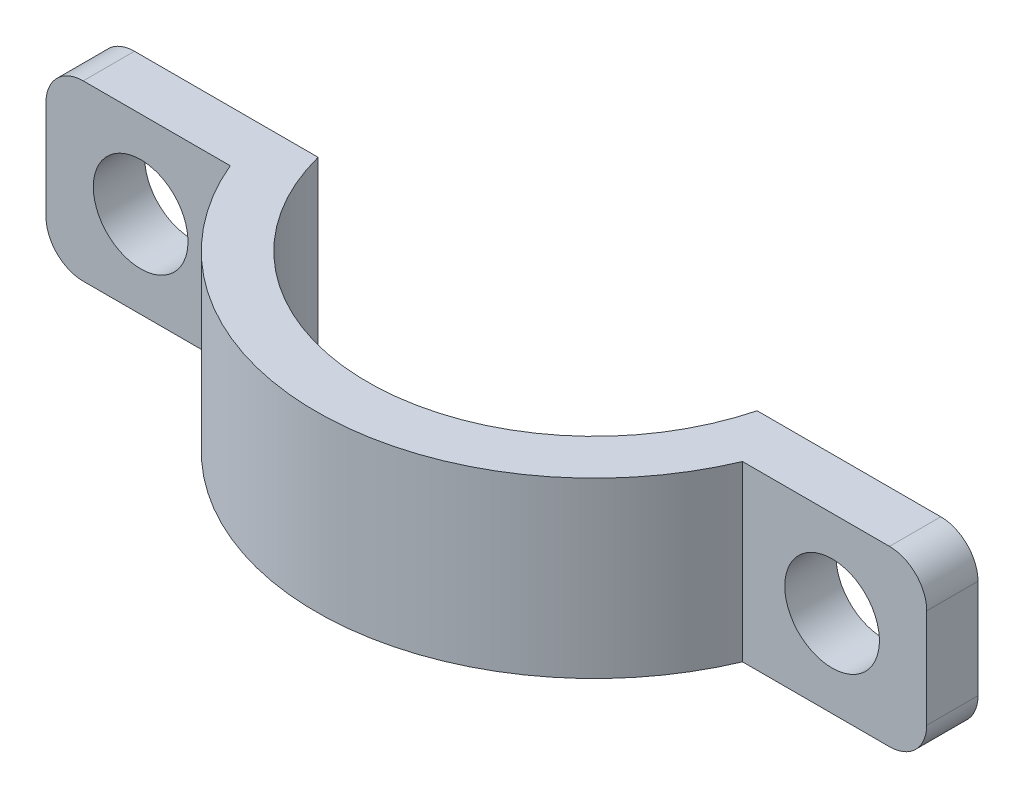
ISO-10303-21;
HEADER;
FILE_DESCRIPTION(('STEP AP214'),'2;1');
FILE_NAME('part.step','',(''),(''),'','','');
FILE_SCHEMA(('AUTOMOTIVE_DESIGN { 1 0 10303 214 1 1 1 1 }'));
ENDSEC;
DATA;
#1=APPLICATION_CONTEXT('core data for automotive mechanical design processes');
#2=APPLICATION_PROTOCOL_DEFINITION('international standard','automotive_design',2000,#1);
#3=PRODUCT_CONTEXT('',#1,'mechanical');
#4=PRODUCT('Part','Part','',(#3));
#5=PRODUCT_RELATED_PRODUCT_CATEGORY('part','',(#4));
#6=PRODUCT_DEFINITION_FORMATION('','',#4);
#7=PRODUCT_DEFINITION_CONTEXT('part definition',#1,'design');
#8=PRODUCT_DEFINITION('design','',#6,#7);
#9=PRODUCT_DEFINITION_SHAPE('','',#8);
#10=(LENGTH_UNIT() NAMED_UNIT(*) SI_UNIT(.MILLI.,.METRE.));
#11=(NAMED_UNIT(*) PLANE_ANGLE_UNIT() SI_UNIT($,.RADIAN.));
#12=(NAMED_UNIT(*) SI_UNIT($,.STERADIAN.) SOLID_ANGLE_UNIT());
#13=UNCERTAINTY_MEASURE_WITH_UNIT(LENGTH_MEASURE(1.E-05),#10,'distance_accuracy_value','');
#14=(GEOMETRIC_REPRESENTATION_CONTEXT(3) GLOBAL_UNCERTAINTY_ASSIGNED_CONTEXT((#13)) GLOBAL_UNIT_ASSIGNED_CONTEXT((#10,
#11,#12)) REPRESENTATION_CONTEXT('',''));
#15=CARTESIAN_POINT('',(0.,0.,0.));
#16=DIRECTION('',(0.,0.,1.));
#17=DIRECTION('',(1.,0.,0.));
#18=AXIS2_PLACEMENT_3D('',#15,#16,#17);
#19=CARTESIAN_POINT('',(-27.9162315761525,11.,22.7193999397355));
#20=DIRECTION('',(1.,0.,0.));
#21=DIRECTION('',(0.,0.,-1.));
#22=AXIS2_PLACEMENT_3D('',#19,#20,#21);
#23=PLANE('',#22);
#24=DIRECTION('',(0.,-1.,0.));
#25=VECTOR('',#24,1.);
#26=CARTESIAN_POINT('',(-27.9162315761525,20.,6.85265509296923));
#27=LINE('',#26,#25);
#28=CARTESIAN_POINT('',(-27.9162315761525,8.64,6.85265509296923));
#29=VERTEX_POINT('',#28);
#30=CARTESIAN_POINT('',(-27.9162315761525,2.36,6.85265509296923));
#31=VERTEX_POINT('',#30);
#32=EDGE_CURVE('E148',#29,#31,#27,.T.);
#33=ORIENTED_EDGE('',*,*,#32,.F.);
#34=DIRECTION('',(0.,0.,1.));
#35=VECTOR('',#34,1.);
#36=CARTESIAN_POINT('',(-27.9162315761525,8.64,3.60265509296923));
#37=LINE('',#36,#35);
#38=CARTESIAN_POINT('',(-27.9162315761525,8.64,3.60265509296923));
#39=VERTEX_POINT('',#38);
#40=EDGE_CURVE('E58',#29,#39,#37,.F.);
#41=ORIENTED_EDGE('',*,*,#40,.T.);
#42=DIRECTION('',(0.,-1.,0.));
#43=VECTOR('',#42,1.);
#44=CARTESIAN_POINT('',(-27.9162315761525,11.,3.60265509296923));
#45=LINE('',#44,#43);
#46=CARTESIAN_POINT('',(-27.9162315761525,2.36,3.60265509296923));
#47=VERTEX_POINT('',#46);
#48=EDGE_CURVE('E184',#39,#47,#45,.T.);
#49=ORIENTED_EDGE('',*,*,#48,.T.);
#50=DIRECTION('',(0.,0.,1.));
#51=VECTOR('',#50,1.);
#52=CARTESIAN_POINT('',(-27.9162315761525,2.36,22.7193999397355));
#53=LINE('',#52,#51);
#54=EDGE_CURVE('E229',#47,#31,#53,.T.);
#55=ORIENTED_EDGE('',*,*,#54,.T.);
#56=EDGE_LOOP('',(#33,#41,#49,#55));
#57=FACE_BOUND('',#56,.T.);
#58=ADVANCED_FACE('F37',(#57),#23,.F.);
#59=CARTESIAN_POINT('',(27.9162315761525,11.,22.7193999397355));
#60=DIRECTION('',(-1.,0.,0.));
#61=DIRECTION('',(0.,0.,1.));
#62=AXIS2_PLACEMENT_3D('',#59,#60,#61);
#63=PLANE('',#62);
#64=DIRECTION('',(0.,-1.,0.));
#65=VECTOR('',#64,1.);
#66=CARTESIAN_POINT('',(27.9162315761525,20.,6.85265509296923));
#67=LINE('',#66,#65);
#68=CARTESIAN_POINT('',(27.9162315761525,8.64,6.85265509296923));
#69=VERTEX_POINT('',#68);
#70=CARTESIAN_POINT('',(27.9162315761525,2.36,6.85265509296923));
#71=VERTEX_POINT('',#70);
#72=EDGE_CURVE('E157',#69,#71,#67,.T.);
#73=ORIENTED_EDGE('',*,*,#72,.T.);
#74=DIRECTION('',(0.,0.,-1.));
#75=VECTOR('',#74,1.);
#76=CARTESIAN_POINT('',(27.9162315761525,2.36,22.7193999397355));
#77=LINE('',#76,#75);
#78=CARTESIAN_POINT('',(27.9162315761525,2.36,3.60265509296923));
#79=VERTEX_POINT('',#78);
#80=EDGE_CURVE('E205',#71,#79,#77,.T.);
#81=ORIENTED_EDGE('',*,*,#80,.T.);
#82=DIRECTION('',(0.,-1.,0.));
#83=VECTOR('',#82,1.);
#84=CARTESIAN_POINT('',(27.9162315761525,11.,3.60265509296923));
#85=LINE('',#84,#83);
#86=CARTESIAN_POINT('',(27.9162315761525,8.64,3.60265509296923));
#87=VERTEX_POINT('',#86);
#88=EDGE_CURVE('E196',#87,#79,#85,.T.);
#89=ORIENTED_EDGE('',*,*,#88,.F.);
#90=DIRECTION('',(0.,0.,-1.));
#91=VECTOR('',#90,1.);
#92=CARTESIAN_POINT('',(27.9162315761525,8.64,6.85265509296923));
#93=LINE('',#92,#91);
#94=EDGE_CURVE('E199',#87,#69,#93,.F.);
#95=ORIENTED_EDGE('',*,*,#94,.T.);
#96=EDGE_LOOP('',(#73,#81,#89,#95));
#97=FACE_BOUND('',#96,.T.);
#98=ADVANCED_FACE('F254',(#97),#63,.F.);
#99=CARTESIAN_POINT('',(13.9162315761525,11.,3.60265509296923));
#100=DIRECTION('',(0.,0.,1.));
#101=DIRECTION('',(1.,0.,0.));
#102=AXIS2_PLACEMENT_3D('',#99,#100,#101);
#103=PLANE('',#102);
#104=CARTESIAN_POINT('',(21.9162315761525,5.5,3.60265509296923));
#105=DIRECTION('',(0.,0.,-1.));
#106=DIRECTION('',(-1.,0.,0.));
#107=AXIS2_PLACEMENT_3D('',#104,#105,#106);
#108=CIRCLE('',#107,3.);
#109=CARTESIAN_POINT('',(18.9162315761525,5.5,3.60265509296923));
#110=VERTEX_POINT('',#109);
#111=EDGE_CURVE('E169',#110,#110,#108,.T.);
#112=ORIENTED_EDGE('',*,*,#111,.F.);
#113=EDGE_LOOP('',(#112));
#114=FACE_BOUND('',#113,.T.);
#115=ORIENTED_EDGE('',*,*,#88,.T.);
#116=CARTESIAN_POINT('',(25.5562315761525,2.36,3.60265509296923));
#117=DIRECTION('',(0.,0.,1.));
#118=DIRECTION('',(1.,0.,0.));
#119=AXIS2_PLACEMENT_3D('',#116,#117,#118);
#120=CIRCLE('',#119,2.36);
#121=CARTESIAN_POINT('',(25.5562315761525,0.,3.60265509296923));
#122=VERTEX_POINT('',#121);
#123=EDGE_CURVE('E210',#79,#122,#120,.F.);
#124=ORIENTED_EDGE('',*,*,#123,.T.);
#125=DIRECTION('',(-1.,0.,0.));
#126=VECTOR('',#125,1.);
#127=CARTESIAN_POINT('',(13.9162315761525,0.,3.60265509296923));
#128=LINE('',#127,#126);
#129=CARTESIAN_POINT('',(13.9162315761525,0.,3.60265509296923));
#130=VERTEX_POINT('',#129);
#131=EDGE_CURVE('E173',#122,#130,#128,.T.);
#132=ORIENTED_EDGE('',*,*,#131,.T.);
#133=DIRECTION('',(0.,-1.,0.));
#134=VECTOR('',#133,1.);
#135=CARTESIAN_POINT('',(13.9162315761525,11.,3.60265509296923));
#136=LINE('',#135,#134);
#137=CARTESIAN_POINT('',(13.9162315761525,11.,3.60265509296923));
#138=VERTEX_POINT('',#137);
#139=EDGE_CURVE('E193',#138,#130,#136,.T.);
#140=ORIENTED_EDGE('',*,*,#139,.F.);
#141=DIRECTION('',(-1.,0.,0.));
#142=VECTOR('',#141,1.);
#143=CARTESIAN_POINT('',(13.9162315761525,11.,3.60265509296923));
#144=LINE('',#143,#142);
#145=CARTESIAN_POINT('',(25.5562315761525,11.,3.60265509296923));
#146=VERTEX_POINT('',#145);
#147=EDGE_CURVE('E176',#146,#138,#144,.T.);
#148=ORIENTED_EDGE('',*,*,#147,.F.);
#149=CARTESIAN_POINT('',(25.5562315761525,8.64,3.60265509296923));
#150=DIRECTION('',(0.,0.,1.));
#151=DIRECTION('',(1.,0.,0.));
#152=AXIS2_PLACEMENT_3D('',#149,#150,#151);
#153=CIRCLE('',#152,2.36);
#154=EDGE_CURVE('E208',#146,#87,#153,.F.);
#155=ORIENTED_EDGE('',*,*,#154,.T.);
#156=EDGE_LOOP('',(#115,#124,#132,#140,#148,#155));
#157=FACE_BOUND('',#156,.T.);
#158=ADVANCED_FACE('F259',(#114,#157),#103,.F.);
#159=CARTESIAN_POINT('',(0.,11.,0.));
#160=DIRECTION('',(0.,-1.,0.));
#161=DIRECTION('',(0.,0.,-1.));
#162=AXIS2_PLACEMENT_3D('',#159,#160,#161);
#163=CYLINDRICAL_SURFACE('',#162,14.375);
#164=CARTESIAN_POINT('',(0.,0.,0.));
#165=DIRECTION('',(0.,-1.,0.));
#166=DIRECTION('',(0.,0.,1.));
#167=AXIS2_PLACEMENT_3D('',#164,#165,#166);
#168=CIRCLE('',#167,14.375);
#169=CARTESIAN_POINT('',(-13.9162315761525,0.,3.60265509296922));
#170=VERTEX_POINT('',#169);
#171=EDGE_CURVE('E186',#130,#170,#168,.T.);
#172=ORIENTED_EDGE('',*,*,#171,.T.);
#173=DIRECTION('',(0.,-1.,0.));
#174=VECTOR('',#173,1.);
#175=CARTESIAN_POINT('',(-13.9162315761525,11.,3.60265509296922));
#176=LINE('',#175,#174);
#177=CARTESIAN_POINT('',(-13.9162315761525,11.,3.60265509296922));
#178=VERTEX_POINT('',#177);
#179=EDGE_CURVE('E190',#178,#170,#176,.T.);
#180=ORIENTED_EDGE('',*,*,#179,.F.);
#181=CARTESIAN_POINT('',(0.,11.,0.));
#182=DIRECTION('',(0.,-1.,0.));
#183=DIRECTION('',(0.,0.,1.));
#184=AXIS2_PLACEMENT_3D('',#181,#182,#183);
#185=CIRCLE('',#184,14.375);
#186=EDGE_CURVE('E178',#138,#178,#185,.T.);
#187=ORIENTED_EDGE('',*,*,#186,.F.);
#188=ORIENTED_EDGE('',*,*,#139,.T.);
#189=EDGE_LOOP('',(#172,#180,#187,#188));
#190=FACE_BOUND('',#189,.T.);
#191=ADVANCED_FACE('F283',(#190),#163,.F.);
#192=CARTESIAN_POINT('',(-27.9162315761525,11.,3.60265509296923));
#193=DIRECTION('',(0.,0.,1.));
#194=DIRECTION('',(1.,0.,0.));
#195=AXIS2_PLACEMENT_3D('',#192,#193,#194);
#196=PLANE('',#195);
#197=CARTESIAN_POINT('',(-21.9162315761525,5.5,3.60265509296923));
#198=DIRECTION('',(0.,0.,-1.));
#199=DIRECTION('',(-1.,0.,0.));
#200=AXIS2_PLACEMENT_3D('',#197,#198,#199);
#201=CIRCLE('',#200,3.);
#202=CARTESIAN_POINT('',(-24.9162315761525,5.5,3.60265509296923));
#203=VERTEX_POINT('',#202);
#204=EDGE_CURVE('E170',#203,#203,#201,.T.);
#205=ORIENTED_EDGE('',*,*,#204,.F.);
#206=EDGE_LOOP('',(#205));
#207=FACE_BOUND('',#206,.T.);
#208=ORIENTED_EDGE('',*,*,#48,.F.);
#209=CARTESIAN_POINT('',(-25.5562315761525,8.64,3.60265509296923));
#210=DIRECTION('',(0.,0.,1.));
#211=DIRECTION('',(1.,0.,0.));
#212=AXIS2_PLACEMENT_3D('',#209,#210,#211);
#213=CIRCLE('',#212,2.36);
#214=CARTESIAN_POINT('',(-25.5562315761525,11.,3.60265509296923));
#215=VERTEX_POINT('',#214);
#216=EDGE_CURVE('E11',#39,#215,#213,.F.);
#217=ORIENTED_EDGE('',*,*,#216,.T.);
#218=DIRECTION('',(-1.,0.,0.));
#219=VECTOR('',#218,1.);
#220=CARTESIAN_POINT('',(-27.9162315761525,11.,3.60265509296923));
#221=LINE('',#220,#219);
#222=EDGE_CURVE('E181',#178,#215,#221,.T.);
#223=ORIENTED_EDGE('',*,*,#222,.F.);
#224=ORIENTED_EDGE('',*,*,#179,.T.);
#225=DIRECTION('',(-1.,0.,0.));
#226=VECTOR('',#225,1.);
#227=CARTESIAN_POINT('',(-27.9162315761525,0.,3.60265509296923));
#228=LINE('',#227,#226);
#229=CARTESIAN_POINT('',(-25.5562315761525,0.,3.60265509296923));
#230=VERTEX_POINT('',#229);
#231=EDGE_CURVE('E179',#170,#230,#228,.T.);
#232=ORIENTED_EDGE('',*,*,#231,.T.);
#233=CARTESIAN_POINT('',(-25.5562315761525,2.36,3.60265509296923));
#234=DIRECTION('',(0.,0.,1.));
#235=DIRECTION('',(1.,0.,0.));
#236=AXIS2_PLACEMENT_3D('',#233,#234,#235);
#237=CIRCLE('',#236,2.36);
#238=EDGE_CURVE('E45',#230,#47,#237,.F.);
#239=ORIENTED_EDGE('',*,*,#238,.T.);
#240=EDGE_LOOP('',(#208,#217,#223,#224,#232,#239));
#241=FACE_BOUND('',#240,.T.);
#242=ADVANCED_FACE('F244',(#207,#241),#196,.F.);
#243=CARTESIAN_POINT('',(0.,11.,0.));
#244=DIRECTION('',(0.,1.,0.));
#245=DIRECTION('',(0.,0.,1.));
#246=AXIS2_PLACEMENT_3D('',#243,#244,#245);
#247=PLANE('',#246);
#248=DIRECTION('',(-1.,0.,0.));
#249=VECTOR('',#248,1.);
#250=CARTESIAN_POINT('',(0.,11.,6.85265509296923));
#251=LINE('',#250,#249);
#252=CARTESIAN_POINT('',(25.5562315761525,11.,6.85265509296923));
#253=VERTEX_POINT('',#252);
#254=CARTESIAN_POINT('',(16.238280179157,11.,6.85265509296923));
#255=VERTEX_POINT('',#254);
#256=EDGE_CURVE('E163',#253,#255,#251,.T.);
#257=ORIENTED_EDGE('',*,*,#256,.F.);
#258=DIRECTION('',(0.,0.,-1.));
#259=VECTOR('',#258,1.);
#260=CARTESIAN_POINT('',(25.5562315761525,11.,3.60265509296923));
#261=LINE('',#260,#259);
#262=EDGE_CURVE('E223',#253,#146,#261,.T.);
#263=ORIENTED_EDGE('',*,*,#262,.T.);
#264=ORIENTED_EDGE('',*,*,#147,.T.);
#265=ORIENTED_EDGE('',*,*,#186,.T.);
#266=ORIENTED_EDGE('',*,*,#222,.T.);
#267=DIRECTION('',(0.,0.,1.));
#268=VECTOR('',#267,1.);
#269=CARTESIAN_POINT('',(-25.5562315761525,11.,6.85265509296923));
#270=LINE('',#269,#268);
#271=CARTESIAN_POINT('',(-25.5562315761525,11.,6.85265509296923));
#272=VERTEX_POINT('',#271);
#273=EDGE_CURVE('E220',#215,#272,#270,.T.);
#274=ORIENTED_EDGE('',*,*,#273,.T.);
#275=DIRECTION('',(-1.,0.,0.));
#276=VECTOR('',#275,1.);
#277=CARTESIAN_POINT('',(0.,11.,6.85265509296921));
#278=LINE('',#277,#276);
#279=CARTESIAN_POINT('',(-16.238280179157,11.,6.85265509296922));
#280=VERTEX_POINT('',#279);
#281=EDGE_CURVE('E166',#280,#272,#278,.T.);
#282=ORIENTED_EDGE('',*,*,#281,.F.);
#283=CARTESIAN_POINT('',(0.,11.,0.));
#284=DIRECTION('',(0.,1.,0.));
#285=DIRECTION('',(0.,0.,1.));
#286=AXIS2_PLACEMENT_3D('',#283,#284,#285);
#287=CIRCLE('',#286,17.625);
#288=EDGE_CURVE('E146',#255,#280,#287,.F.);
#289=ORIENTED_EDGE('',*,*,#288,.F.);
#290=EDGE_LOOP('',(#257,#263,#264,#265,#266,#274,#282,#289));
#291=FACE_BOUND('',#290,.T.);
#292=ADVANCED_FACE('F240',(#291),#247,.T.);
#293=CARTESIAN_POINT('',(0.,0.,0.));
#294=DIRECTION('',(0.,1.,0.));
#295=DIRECTION('',(0.,0.,1.));
#296=AXIS2_PLACEMENT_3D('',#293,#294,#295);
#297=PLANE('',#296);
#298=ORIENTED_EDGE('',*,*,#131,.F.);
#299=DIRECTION('',(0.,0.,-1.));
#300=VECTOR('',#299,1.);
#301=CARTESIAN_POINT('',(25.5562315761525,0.,0.));
#302=LINE('',#301,#300);
#303=CARTESIAN_POINT('',(25.5562315761525,0.,6.85265509296923));
#304=VERTEX_POINT('',#303);
#305=EDGE_CURVE('E214',#122,#304,#302,.F.);
#306=ORIENTED_EDGE('',*,*,#305,.T.);
#307=DIRECTION('',(1.,0.,0.));
#308=VECTOR('',#307,1.);
#309=CARTESIAN_POINT('',(27.9162315761525,0.,6.85265509296923));
#310=LINE('',#309,#308);
#311=CARTESIAN_POINT('',(16.238280179157,0.,6.85265509296923));
#312=VERTEX_POINT('',#311);
#313=EDGE_CURVE('E153',#312,#304,#310,.T.);
#314=ORIENTED_EDGE('',*,*,#313,.F.);
#315=CARTESIAN_POINT('',(0.,0.,0.));
#316=DIRECTION('',(0.,1.,0.));
#317=DIRECTION('',(0.,0.,-1.));
#318=AXIS2_PLACEMENT_3D('',#315,#316,#317);
#319=CIRCLE('',#318,17.625);
#320=CARTESIAN_POINT('',(-16.238280179157,0.,6.85265509296922));
#321=VERTEX_POINT('',#320);
#322=EDGE_CURVE('E138',#321,#312,#319,.T.);
#323=ORIENTED_EDGE('',*,*,#322,.F.);
#324=DIRECTION('',(1.,0.,0.));
#325=VECTOR('',#324,1.);
#326=CARTESIAN_POINT('',(-16.238280179157,0.,6.85265509296922));
#327=LINE('',#326,#325);
#328=CARTESIAN_POINT('',(-25.5562315761525,0.,6.85265509296923));
#329=VERTEX_POINT('',#328);
#330=EDGE_CURVE('E126',#329,#321,#327,.T.);
#331=ORIENTED_EDGE('',*,*,#330,.F.);
#332=DIRECTION('',(0.,0.,1.));
#333=VECTOR('',#332,1.);
#334=CARTESIAN_POINT('',(-25.5562315761525,0.,0.));
#335=LINE('',#334,#333);
#336=EDGE_CURVE('E212',#329,#230,#335,.F.);
#337=ORIENTED_EDGE('',*,*,#336,.T.);
#338=ORIENTED_EDGE('',*,*,#231,.F.);
#339=ORIENTED_EDGE('',*,*,#171,.F.);
#340=EDGE_LOOP('',(#298,#306,#314,#323,#331,#337,#338,#339));
#341=FACE_BOUND('',#340,.T.);
#342=ADVANCED_FACE('F151',(#341),#297,.F.);
#343=CARTESIAN_POINT('',(-21.9162315761525,5.5,33.6026550929692));
#344=DIRECTION('',(0.,0.,-1.));
#345=DIRECTION('',(-1.,0.,0.));
#346=AXIS2_PLACEMENT_3D('',#343,#344,#345);
#347=CYLINDRICAL_SURFACE('',#346,3.);
#348=CARTESIAN_POINT('',(-21.9162315761525,5.5,6.85265509296923));
#349=DIRECTION('',(0.,0.,-1.));
#350=DIRECTION('',(-1.,0.,0.));
#351=AXIS2_PLACEMENT_3D('',#348,#349,#350);
#352=CIRCLE('',#351,3.);
#353=CARTESIAN_POINT('',(-24.9162315761525,5.5,6.85265509296923));
#354=VERTEX_POINT('',#353);
#355=EDGE_CURVE('E165',#354,#354,#352,.F.);
#356=ORIENTED_EDGE('',*,*,#355,.T.);
#357=EDGE_LOOP('',(#356));
#358=FACE_BOUND('',#357,.T.);
#359=ORIENTED_EDGE('',*,*,#204,.T.);
#360=EDGE_LOOP('',(#359));
#361=FACE_BOUND('',#360,.T.);
#362=ADVANCED_FACE('F296',(#358,#361),#347,.F.);
#363=CARTESIAN_POINT('',(21.9162315761525,5.5,33.6026550929692));
#364=DIRECTION('',(0.,0.,-1.));
#365=DIRECTION('',(-1.,0.,0.));
#366=AXIS2_PLACEMENT_3D('',#363,#364,#365);
#367=CYLINDRICAL_SURFACE('',#366,3.);
#368=CARTESIAN_POINT('',(21.9162315761525,5.5,6.85265509296923));
#369=DIRECTION('',(0.,0.,-1.));
#370=DIRECTION('',(-1.,0.,0.));
#371=AXIS2_PLACEMENT_3D('',#368,#369,#370);
#372=CIRCLE('',#371,3.);
#373=CARTESIAN_POINT('',(18.9162315761525,5.5,6.85265509296923));
#374=VERTEX_POINT('',#373);
#375=EDGE_CURVE('E160',#374,#374,#372,.F.);
#376=ORIENTED_EDGE('',*,*,#375,.T.);
#377=EDGE_LOOP('',(#376));
#378=FACE_BOUND('',#377,.T.);
#379=ORIENTED_EDGE('',*,*,#111,.T.);
#380=EDGE_LOOP('',(#379));
#381=FACE_BOUND('',#380,.T.);
#382=ADVANCED_FACE('F299',(#378,#381),#367,.F.);
#383=CARTESIAN_POINT('',(-16.238280179157,20.,6.85265509296922));
#384=DIRECTION('',(0.,0.,-1.));
#385=DIRECTION('',(-1.,0.,0.));
#386=AXIS2_PLACEMENT_3D('',#383,#384,#385);
#387=PLANE('',#386);
#388=ORIENTED_EDGE('',*,*,#281,.T.);
#389=CARTESIAN_POINT('',(-25.5562315761525,8.64,6.85265509296923));
#390=DIRECTION('',(0.,0.,-1.));
#391=DIRECTION('',(-1.,0.,0.));
#392=AXIS2_PLACEMENT_3D('',#389,#390,#391);
#393=CIRCLE('',#392,2.36);
#394=EDGE_CURVE('E227',#272,#29,#393,.F.);
#395=ORIENTED_EDGE('',*,*,#394,.T.);
#396=ORIENTED_EDGE('',*,*,#32,.T.);
#397=CARTESIAN_POINT('',(-25.5562315761525,2.36,6.85265509296923));
#398=DIRECTION('',(0.,0.,-1.));
#399=DIRECTION('',(-1.,0.,0.));
#400=AXIS2_PLACEMENT_3D('',#397,#398,#399);
#401=CIRCLE('',#400,2.36);
#402=EDGE_CURVE('E134',#31,#329,#401,.F.);
#403=ORIENTED_EDGE('',*,*,#402,.T.);
#404=ORIENTED_EDGE('',*,*,#330,.T.);
#405=DIRECTION('',(0.,-1.,0.));
#406=VECTOR('',#405,1.);
#407=CARTESIAN_POINT('',(-16.238280179157,20.,6.85265509296922));
#408=LINE('',#407,#406);
#409=EDGE_CURVE('E131',#280,#321,#408,.T.);
#410=ORIENTED_EDGE('',*,*,#409,.F.);
#411=EDGE_LOOP('',(#388,#395,#396,#403,#404,#410));
#412=FACE_BOUND('',#411,.T.);
#413=ORIENTED_EDGE('',*,*,#355,.F.);
#414=EDGE_LOOP('',(#413));
#415=FACE_BOUND('',#414,.T.);
#416=ADVANCED_FACE('F129',(#412,#415),#387,.F.);
#417=CARTESIAN_POINT('',(27.9162315761525,20.,6.85265509296923));
#418=DIRECTION('',(0.,0.,-1.));
#419=DIRECTION('',(-1.,0.,0.));
#420=AXIS2_PLACEMENT_3D('',#417,#418,#419);
#421=PLANE('',#420);
#422=ORIENTED_EDGE('',*,*,#313,.T.);
#423=CARTESIAN_POINT('',(25.5562315761525,2.36,6.85265509296923));
#424=DIRECTION('',(0.,0.,-1.));
#425=DIRECTION('',(-1.,0.,0.));
#426=AXIS2_PLACEMENT_3D('',#423,#424,#425);
#427=CIRCLE('',#426,2.36);
#428=EDGE_CURVE('E218',#304,#71,#427,.F.);
#429=ORIENTED_EDGE('',*,*,#428,.T.);
#430=ORIENTED_EDGE('',*,*,#72,.F.);
#431=CARTESIAN_POINT('',(25.5562315761525,8.64,6.85265509296923));
#432=DIRECTION('',(0.,0.,-1.));
#433=DIRECTION('',(-1.,0.,0.));
#434=AXIS2_PLACEMENT_3D('',#431,#432,#433);
#435=CIRCLE('',#434,2.36);
#436=EDGE_CURVE('E216',#69,#253,#435,.F.);
#437=ORIENTED_EDGE('',*,*,#436,.T.);
#438=ORIENTED_EDGE('',*,*,#256,.T.);
#439=DIRECTION('',(0.,-1.,0.));
#440=VECTOR('',#439,1.);
#441=CARTESIAN_POINT('',(16.238280179157,20.,6.85265509296923));
#442=LINE('',#441,#440);
#443=EDGE_CURVE('E147',#255,#312,#442,.T.);
#444=ORIENTED_EDGE('',*,*,#443,.T.);
#445=EDGE_LOOP('',(#422,#429,#430,#437,#438,#444));
#446=FACE_BOUND('',#445,.T.);
#447=ORIENTED_EDGE('',*,*,#375,.F.);
#448=EDGE_LOOP('',(#447));
#449=FACE_BOUND('',#448,.T.);
#450=ADVANCED_FACE('F277',(#446,#449),#421,.F.);
#451=CARTESIAN_POINT('',(0.,20.,0.));
#452=DIRECTION('',(0.,-1.,0.));
#453=DIRECTION('',(0.,0.,-1.));
#454=AXIS2_PLACEMENT_3D('',#451,#452,#453);
#455=CYLINDRICAL_SURFACE('',#454,17.625);
#456=ORIENTED_EDGE('',*,*,#288,.T.);
#457=ORIENTED_EDGE('',*,*,#409,.T.);
#458=ORIENTED_EDGE('',*,*,#322,.T.);
#459=ORIENTED_EDGE('',*,*,#443,.F.);
#460=EDGE_LOOP('',(#456,#457,#458,#459));
#461=FACE_BOUND('',#460,.T.);
#462=ADVANCED_FACE('F142',(#461),#455,.T.);
#463=CARTESIAN_POINT('',(25.5562315761525,2.36,22.7193999397355));
#464=DIRECTION('',(0.,0.,-1.));
#465=DIRECTION('',(-1.,0.,0.));
#466=AXIS2_PLACEMENT_3D('',#463,#464,#465);
#467=CYLINDRICAL_SURFACE('',#466,2.36);
#468=ORIENTED_EDGE('',*,*,#428,.F.);
#469=ORIENTED_EDGE('',*,*,#305,.F.);
#470=ORIENTED_EDGE('',*,*,#123,.F.);
#471=ORIENTED_EDGE('',*,*,#80,.F.);
#472=EDGE_LOOP('',(#468,#469,#470,#471));
#473=FACE_BOUND('',#472,.T.);
#474=ADVANCED_FACE('F264',(#473),#467,.T.);
#475=CARTESIAN_POINT('',(25.5562315761525,8.64,0.));
#476=DIRECTION('',(0.,0.,1.));
#477=DIRECTION('',(1.,0.,0.));
#478=AXIS2_PLACEMENT_3D('',#475,#476,#477);
#479=CYLINDRICAL_SURFACE('',#478,2.36);
#480=ORIENTED_EDGE('',*,*,#436,.F.);
#481=ORIENTED_EDGE('',*,*,#94,.F.);
#482=ORIENTED_EDGE('',*,*,#154,.F.);
#483=ORIENTED_EDGE('',*,*,#262,.F.);
#484=EDGE_LOOP('',(#480,#481,#482,#483));
#485=FACE_BOUND('',#484,.T.);
#486=ADVANCED_FACE('F252',(#485),#479,.T.);
#487=CARTESIAN_POINT('',(-25.5562315761525,8.64,0.));
#488=DIRECTION('',(0.,0.,-1.));
#489=DIRECTION('',(-1.,0.,0.));
#490=AXIS2_PLACEMENT_3D('',#487,#488,#489);
#491=CYLINDRICAL_SURFACE('',#490,2.36);
#492=ORIENTED_EDGE('',*,*,#216,.F.);
#493=ORIENTED_EDGE('',*,*,#40,.F.);
#494=ORIENTED_EDGE('',*,*,#394,.F.);
#495=ORIENTED_EDGE('',*,*,#273,.F.);
#496=EDGE_LOOP('',(#492,#493,#494,#495));
#497=FACE_BOUND('',#496,.T.);
#498=ADVANCED_FACE('F237',(#497),#491,.T.);
#499=CARTESIAN_POINT('',(-25.5562315761525,2.36,22.7193999397355));
#500=DIRECTION('',(0.,0.,1.));
#501=DIRECTION('',(1.,0.,0.));
#502=AXIS2_PLACEMENT_3D('',#499,#500,#501);
#503=CYLINDRICAL_SURFACE('',#502,2.36);
#504=ORIENTED_EDGE('',*,*,#238,.F.);
#505=ORIENTED_EDGE('',*,*,#336,.F.);
#506=ORIENTED_EDGE('',*,*,#402,.F.);
#507=ORIENTED_EDGE('',*,*,#54,.F.);
#508=EDGE_LOOP('',(#504,#505,#506,#507));
#509=FACE_BOUND('',#508,.T.);
#510=ADVANCED_FACE('F39',(#509),#503,.T.);
#511=CLOSED_SHELL('',(#58,#98,#158,#191,#242,#292,#342,#362,#382,#416,#450,#462,#474,#486,#498,#510));
#512=MANIFOLD_SOLID_BREP('B2',#511);
#513=ADVANCED_BREP_SHAPE_REPRESENTATION('',(#18,#512),#14);
#514=SHAPE_DEFINITION_REPRESENTATION(#9,#513);
ENDSEC;
END-ISO-10303-21;
